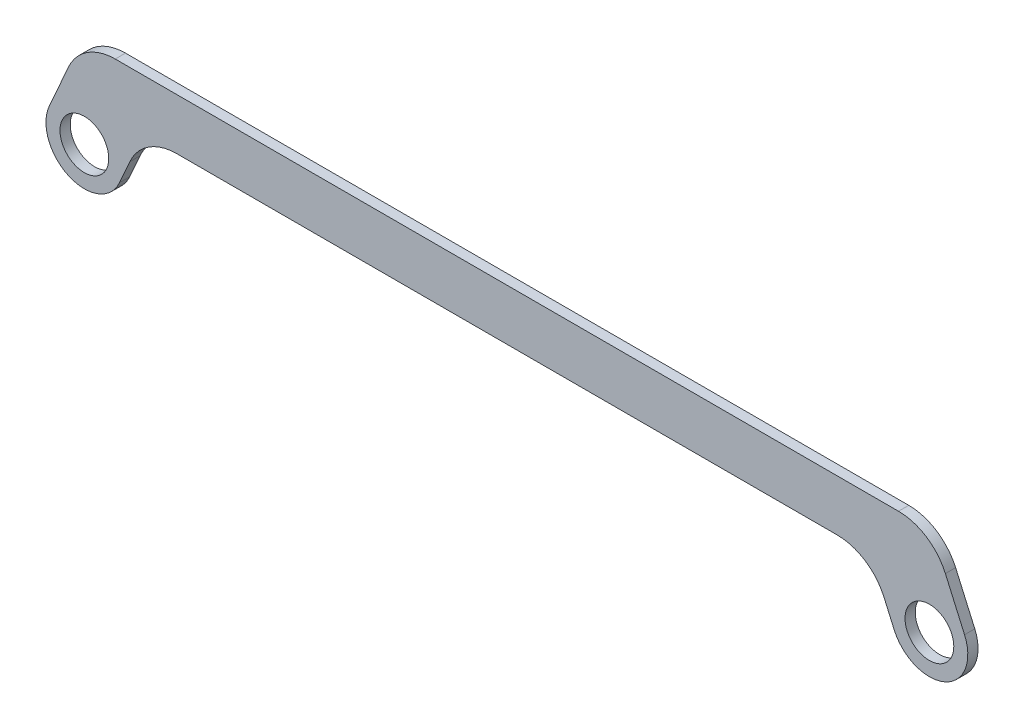
ISO-10303-21;
HEADER;
FILE_DESCRIPTION(('STEP AP214'),'2;1');
FILE_NAME('part.step','',(''),(''),'','','');
FILE_SCHEMA(('AUTOMOTIVE_DESIGN { 1 0 10303 214 1 1 1 1 }'));
ENDSEC;
DATA;
#1=APPLICATION_CONTEXT('core data for automotive mechanical design processes');
#2=APPLICATION_PROTOCOL_DEFINITION('international standard','automotive_design',2000,#1);
#3=PRODUCT_CONTEXT('',#1,'mechanical');
#4=PRODUCT('Part','Part','',(#3));
#5=PRODUCT_RELATED_PRODUCT_CATEGORY('part','',(#4));
#6=PRODUCT_DEFINITION_FORMATION('','',#4);
#7=PRODUCT_DEFINITION_CONTEXT('part definition',#1,'design');
#8=PRODUCT_DEFINITION('design','',#6,#7);
#9=PRODUCT_DEFINITION_SHAPE('','',#8);
#10=(LENGTH_UNIT() NAMED_UNIT(*) SI_UNIT(.MILLI.,.METRE.));
#11=(NAMED_UNIT(*) PLANE_ANGLE_UNIT() SI_UNIT($,.RADIAN.));
#12=(NAMED_UNIT(*) SI_UNIT($,.STERADIAN.) SOLID_ANGLE_UNIT());
#13=UNCERTAINTY_MEASURE_WITH_UNIT(LENGTH_MEASURE(1.E-05),#10,'distance_accuracy_value','');
#14=(GEOMETRIC_REPRESENTATION_CONTEXT(3) GLOBAL_UNCERTAINTY_ASSIGNED_CONTEXT((#13)) GLOBAL_UNIT_ASSIGNED_CONTEXT((#10,
#11,#12)) REPRESENTATION_CONTEXT('',''));
#15=CARTESIAN_POINT('',(0.,0.,0.));
#16=DIRECTION('',(0.,0.,1.));
#17=DIRECTION('',(1.,0.,0.));
#18=AXIS2_PLACEMENT_3D('',#15,#16,#17);
#19=CARTESIAN_POINT('',(0.,0.,4.));
#20=DIRECTION('',(0.,0.,-1.));
#21=DIRECTION('',(-1.,0.,0.));
#22=AXIS2_PLACEMENT_3D('',#19,#20,#21);
#23=PLANE('',#22);
#24=DIRECTION('',(-0.403699080087146,0.914891825702248,0.));
#25=VECTOR('',#24,1.);
#26=CARTESIAN_POINT('',(343.723377385534,6.05548620130718,4.));
#27=LINE('',#26,#25);
#28=CARTESIAN_POINT('',(343.723377385534,6.05548620130718,4.));
#29=VERTEX_POINT('',#28);
#30=CARTESIAN_POINT('',(336.242456449768,23.0092860746674,4.));
#31=VERTEX_POINT('',#30);
#32=EDGE_CURVE('E207',#29,#31,#27,.T.);
#33=ORIENTED_EDGE('',*,*,#32,.T.);
#34=CARTESIAN_POINT('',(317.944619935723,14.9353044729245,4.));
#35=DIRECTION('',(0.,0.,-1.));
#36=DIRECTION('',(-1.,0.,0.));
#37=AXIS2_PLACEMENT_3D('',#34,#35,#36);
#38=CIRCLE('',#37,20.);
#39=CARTESIAN_POINT('',(317.944619935723,34.9353044729245,4.));
#40=VERTEX_POINT('',#39);
#41=EDGE_CURVE('E174',#31,#40,#38,.F.);
#42=ORIENTED_EDGE('',*,*,#41,.T.);
#43=DIRECTION('',(-1.,0.,0.));
#44=VECTOR('',#43,1.);
#45=CARTESIAN_POINT('',(-0.980060917068303,34.9353044729245,4.));
#46=LINE('',#45,#44);
#47=CARTESIAN_POINT('',(12.0553800642772,34.9353044729245,4.));
#48=VERTEX_POINT('',#47);
#49=EDGE_CURVE('E209',#40,#48,#46,.T.);
#50=ORIENTED_EDGE('',*,*,#49,.T.);
#51=CARTESIAN_POINT('',(12.0553800642772,14.9353044729245,4.));
#52=DIRECTION('',(0.,0.,-1.));
#53=DIRECTION('',(-1.,0.,0.));
#54=AXIS2_PLACEMENT_3D('',#51,#52,#53);
#55=CIRCLE('',#54,20.);
#56=CARTESIAN_POINT('',(-6.24245644976776,23.0092860746674,4.));
#57=VERTEX_POINT('',#56);
#58=EDGE_CURVE('E52',#48,#57,#55,.F.);
#59=ORIENTED_EDGE('',*,*,#58,.T.);
#60=DIRECTION('',(-0.403699080087146,-0.914891825702248,0.));
#61=VECTOR('',#60,1.);
#62=CARTESIAN_POINT('',(-13.7233773855337,6.05548620130718,4.));
#63=LINE('',#62,#61);
#64=CARTESIAN_POINT('',(-13.7233773855337,6.05548620130718,4.));
#65=VERTEX_POINT('',#64);
#66=EDGE_CURVE('E138',#57,#65,#63,.T.);
#67=ORIENTED_EDGE('',*,*,#66,.T.);
#68=CARTESIAN_POINT('',(0.,0.,4.));
#69=DIRECTION('',(0.,0.,1.));
#70=DIRECTION('',(-1.,0.,0.));
#71=AXIS2_PLACEMENT_3D('',#68,#69,#70);
#72=CIRCLE('',#71,15.);
#73=CARTESIAN_POINT('',(13.7233773855337,-6.05548620130718,4.));
#74=VERTEX_POINT('',#73);
#75=EDGE_CURVE('E133',#65,#74,#72,.T.);
#76=ORIENTED_EDGE('',*,*,#75,.T.);
#77=DIRECTION('',(0.403699080087146,0.914891825702248,0.));
#78=VECTOR('',#77,1.);
#79=CARTESIAN_POINT('',(13.7233773855337,-6.05548620130718,4.));
#80=LINE('',#79,#78);
#81=CARTESIAN_POINT('',(17.7232384906447,3.0092860746674,4.));
#82=VERTEX_POINT('',#81);
#83=EDGE_CURVE('E125',#74,#82,#80,.T.);
#84=ORIENTED_EDGE('',*,*,#83,.T.);
#85=CARTESIAN_POINT('',(36.0210750046897,-5.06469552707551,4.));
#86=DIRECTION('',(0.,0.,-1.));
#87=DIRECTION('',(-1.,0.,0.));
#88=AXIS2_PLACEMENT_3D('',#85,#86,#87);
#89=CIRCLE('',#88,20.);
#90=CARTESIAN_POINT('',(36.0210750046897,14.9353044729245,4.));
#91=VERTEX_POINT('',#90);
#92=EDGE_CURVE('E11',#82,#91,#89,.T.);
#93=ORIENTED_EDGE('',*,*,#92,.T.);
#94=DIRECTION('',(1.,0.,0.));
#95=VECTOR('',#94,1.);
#96=CARTESIAN_POINT('',(22.9856340233442,14.9353044729245,4.));
#97=LINE('',#96,#95);
#98=CARTESIAN_POINT('',(293.97892499531,14.9353044729245,4.));
#99=VERTEX_POINT('',#98);
#100=EDGE_CURVE('E132',#91,#99,#97,.T.);
#101=ORIENTED_EDGE('',*,*,#100,.T.);
#102=CARTESIAN_POINT('',(293.97892499531,-5.06469552707551,4.));
#103=DIRECTION('',(0.,0.,-1.));
#104=DIRECTION('',(-1.,0.,0.));
#105=AXIS2_PLACEMENT_3D('',#102,#103,#104);
#106=CIRCLE('',#105,20.);
#107=CARTESIAN_POINT('',(312.276761509355,3.00928607466739,4.));
#108=VERTEX_POINT('',#107);
#109=EDGE_CURVE('E182',#99,#108,#106,.T.);
#110=ORIENTED_EDGE('',*,*,#109,.T.);
#111=DIRECTION('',(0.403699080087146,-0.914891825702248,0.));
#112=VECTOR('',#111,1.);
#113=CARTESIAN_POINT('',(316.276622614466,-6.05548620130718,4.));
#114=LINE('',#113,#112);
#115=CARTESIAN_POINT('',(316.276622614466,-6.05548620130718,4.));
#116=VERTEX_POINT('',#115);
#117=EDGE_CURVE('E201',#108,#116,#114,.T.);
#118=ORIENTED_EDGE('',*,*,#117,.T.);
#119=CARTESIAN_POINT('',(330.,0.,4.));
#120=DIRECTION('',(0.,0.,1.));
#121=DIRECTION('',(1.,0.,0.));
#122=AXIS2_PLACEMENT_3D('',#119,#120,#121);
#123=CIRCLE('',#122,15.);
#124=EDGE_CURVE('E203',#116,#29,#123,.T.);
#125=ORIENTED_EDGE('',*,*,#124,.T.);
#126=EDGE_LOOP('',(#33,#42,#50,#59,#67,#76,#84,#93,#101,#110,#118,#125));
#127=FACE_BOUND('',#126,.T.);
#128=CARTESIAN_POINT('',(0.,0.,4.));
#129=DIRECTION('',(0.,0.,1.));
#130=DIRECTION('',(1.,0.,0.));
#131=AXIS2_PLACEMENT_3D('',#128,#129,#130);
#132=CIRCLE('',#131,9.525);
#133=CARTESIAN_POINT('',(9.525,0.,4.));
#134=VERTEX_POINT('',#133);
#135=EDGE_CURVE('E213',#134,#134,#132,.T.);
#136=ORIENTED_EDGE('',*,*,#135,.F.);
#137=EDGE_LOOP('',(#136));
#138=FACE_BOUND('',#137,.T.);
#139=CARTESIAN_POINT('',(330.,0.,4.));
#140=DIRECTION('',(0.,0.,1.));
#141=DIRECTION('',(1.,0.,0.));
#142=AXIS2_PLACEMENT_3D('',#139,#140,#141);
#143=CIRCLE('',#142,9.52500000000002);
#144=CARTESIAN_POINT('',(339.525,0.,4.));
#145=VERTEX_POINT('',#144);
#146=EDGE_CURVE('E282',#145,#145,#143,.T.);
#147=ORIENTED_EDGE('',*,*,#146,.F.);
#148=EDGE_LOOP('',(#147));
#149=FACE_BOUND('',#148,.T.);
#150=ADVANCED_FACE('F37',(#127,#138,#149),#23,.F.);
#151=CARTESIAN_POINT('',(0.,0.,0.));
#152=DIRECTION('',(0.,0.,-1.));
#153=DIRECTION('',(-1.,0.,0.));
#154=AXIS2_PLACEMENT_3D('',#151,#152,#153);
#155=PLANE('',#154);
#156=CARTESIAN_POINT('',(0.,0.,0.));
#157=DIRECTION('',(0.,0.,1.));
#158=DIRECTION('',(1.,0.,0.));
#159=AXIS2_PLACEMENT_3D('',#156,#157,#158);
#160=CIRCLE('',#159,9.525);
#161=CARTESIAN_POINT('',(9.525,0.,0.));
#162=VERTEX_POINT('',#161);
#163=EDGE_CURVE('E287',#162,#162,#160,.T.);
#164=ORIENTED_EDGE('',*,*,#163,.T.);
#165=EDGE_LOOP('',(#164));
#166=FACE_BOUND('',#165,.T.);
#167=DIRECTION('',(-1.,0.,0.));
#168=VECTOR('',#167,1.);
#169=CARTESIAN_POINT('',(-0.980060917068303,34.9353044729245,0.));
#170=LINE('',#169,#168);
#171=CARTESIAN_POINT('',(317.944619935723,34.9353044729245,0.));
#172=VERTEX_POINT('',#171);
#173=CARTESIAN_POINT('',(12.0553800642772,34.9353044729245,0.));
#174=VERTEX_POINT('',#173);
#175=EDGE_CURVE('E223',#172,#174,#170,.T.);
#176=ORIENTED_EDGE('',*,*,#175,.F.);
#177=CARTESIAN_POINT('',(317.944619935723,14.9353044729245,0.));
#178=DIRECTION('',(0.,0.,-1.));
#179=DIRECTION('',(-1.,0.,0.));
#180=AXIS2_PLACEMENT_3D('',#177,#178,#179);
#181=CIRCLE('',#180,20.);
#182=CARTESIAN_POINT('',(336.242456449768,23.0092860746674,0.));
#183=VERTEX_POINT('',#182);
#184=EDGE_CURVE('E169',#172,#183,#181,.T.);
#185=ORIENTED_EDGE('',*,*,#184,.T.);
#186=DIRECTION('',(-0.403699080087146,0.914891825702248,0.));
#187=VECTOR('',#186,1.);
#188=CARTESIAN_POINT('',(343.723377385534,6.05548620130718,0.));
#189=LINE('',#188,#187);
#190=CARTESIAN_POINT('',(343.723377385534,6.05548620130718,0.));
#191=VERTEX_POINT('',#190);
#192=EDGE_CURVE('E220',#191,#183,#189,.T.);
#193=ORIENTED_EDGE('',*,*,#192,.F.);
#194=CARTESIAN_POINT('',(330.,0.,0.));
#195=DIRECTION('',(0.,0.,1.));
#196=DIRECTION('',(1.,0.,0.));
#197=AXIS2_PLACEMENT_3D('',#194,#195,#196);
#198=CIRCLE('',#197,15.);
#199=CARTESIAN_POINT('',(316.276622614466,-6.05548620130718,0.));
#200=VERTEX_POINT('',#199);
#201=EDGE_CURVE('E218',#200,#191,#198,.T.);
#202=ORIENTED_EDGE('',*,*,#201,.F.);
#203=DIRECTION('',(0.403699080087146,-0.914891825702248,0.));
#204=VECTOR('',#203,1.);
#205=CARTESIAN_POINT('',(316.276622614466,-6.05548620130718,0.));
#206=LINE('',#205,#204);
#207=CARTESIAN_POINT('',(312.276761509355,3.00928607466739,0.));
#208=VERTEX_POINT('',#207);
#209=EDGE_CURVE('E216',#208,#200,#206,.T.);
#210=ORIENTED_EDGE('',*,*,#209,.F.);
#211=CARTESIAN_POINT('',(293.97892499531,-5.06469552707551,0.));
#212=DIRECTION('',(0.,0.,-1.));
#213=DIRECTION('',(-1.,0.,0.));
#214=AXIS2_PLACEMENT_3D('',#211,#212,#213);
#215=CIRCLE('',#214,20.);
#216=CARTESIAN_POINT('',(293.97892499531,14.9353044729245,0.));
#217=VERTEX_POINT('',#216);
#218=EDGE_CURVE('E180',#208,#217,#215,.F.);
#219=ORIENTED_EDGE('',*,*,#218,.T.);
#220=DIRECTION('',(1.,0.,0.));
#221=VECTOR('',#220,1.);
#222=CARTESIAN_POINT('',(22.9856340233442,14.9353044729245,0.));
#223=LINE('',#222,#221);
#224=CARTESIAN_POINT('',(36.0210750046897,14.9353044729245,0.));
#225=VERTEX_POINT('',#224);
#226=EDGE_CURVE('E190',#225,#217,#223,.T.);
#227=ORIENTED_EDGE('',*,*,#226,.F.);
#228=CARTESIAN_POINT('',(36.0210750046897,-5.06469552707551,0.));
#229=DIRECTION('',(0.,0.,-1.));
#230=DIRECTION('',(-1.,0.,0.));
#231=AXIS2_PLACEMENT_3D('',#228,#229,#230);
#232=CIRCLE('',#231,20.);
#233=CARTESIAN_POINT('',(17.7232384906447,3.0092860746674,0.));
#234=VERTEX_POINT('',#233);
#235=EDGE_CURVE('E45',#225,#234,#232,.F.);
#236=ORIENTED_EDGE('',*,*,#235,.T.);
#237=DIRECTION('',(0.403699080087146,0.914891825702248,0.));
#238=VECTOR('',#237,1.);
#239=CARTESIAN_POINT('',(13.7233773855337,-6.05548620130718,0.));
#240=LINE('',#239,#238);
#241=CARTESIAN_POINT('',(13.7233773855337,-6.05548620130718,0.));
#242=VERTEX_POINT('',#241);
#243=EDGE_CURVE('E188',#242,#234,#240,.T.);
#244=ORIENTED_EDGE('',*,*,#243,.F.);
#245=CARTESIAN_POINT('',(0.,0.,0.));
#246=DIRECTION('',(0.,0.,1.));
#247=DIRECTION('',(-1.,0.,0.));
#248=AXIS2_PLACEMENT_3D('',#245,#246,#247);
#249=CIRCLE('',#248,15.);
#250=CARTESIAN_POINT('',(-13.7233773855337,6.05548620130718,0.));
#251=VERTEX_POINT('',#250);
#252=EDGE_CURVE('E146',#251,#242,#249,.T.);
#253=ORIENTED_EDGE('',*,*,#252,.F.);
#254=DIRECTION('',(-0.403699080087146,-0.914891825702248,0.));
#255=VECTOR('',#254,1.);
#256=CARTESIAN_POINT('',(-13.7233773855337,6.05548620130718,0.));
#257=LINE('',#256,#255);
#258=CARTESIAN_POINT('',(-6.24245644976776,23.0092860746674,0.));
#259=VERTEX_POINT('',#258);
#260=EDGE_CURVE('E142',#259,#251,#257,.T.);
#261=ORIENTED_EDGE('',*,*,#260,.F.);
#262=CARTESIAN_POINT('',(12.0553800642772,14.9353044729245,0.));
#263=DIRECTION('',(0.,0.,-1.));
#264=DIRECTION('',(-1.,0.,0.));
#265=AXIS2_PLACEMENT_3D('',#262,#263,#264);
#266=CIRCLE('',#265,20.);
#267=EDGE_CURVE('E167',#259,#174,#266,.T.);
#268=ORIENTED_EDGE('',*,*,#267,.T.);
#269=EDGE_LOOP('',(#176,#185,#193,#202,#210,#219,#227,#236,#244,#253,#261,#268));
#270=FACE_BOUND('',#269,.T.);
#271=CARTESIAN_POINT('',(330.,0.,0.));
#272=DIRECTION('',(0.,0.,1.));
#273=DIRECTION('',(1.,0.,0.));
#274=AXIS2_PLACEMENT_3D('',#271,#272,#273);
#275=CIRCLE('',#274,9.52500000000002);
#276=CARTESIAN_POINT('',(339.525,0.,0.));
#277=VERTEX_POINT('',#276);
#278=EDGE_CURVE('E285',#277,#277,#275,.T.);
#279=ORIENTED_EDGE('',*,*,#278,.T.);
#280=EDGE_LOOP('',(#279));
#281=FACE_BOUND('',#280,.T.);
#282=ADVANCED_FACE('F186',(#166,#270,#281),#155,.T.);
#283=CARTESIAN_POINT('',(0.,0.,4.));
#284=DIRECTION('',(0.,0.,-1.));
#285=DIRECTION('',(-1.,0.,0.));
#286=AXIS2_PLACEMENT_3D('',#283,#284,#285);
#287=CYLINDRICAL_SURFACE('',#286,15.);
#288=ORIENTED_EDGE('',*,*,#252,.T.);
#289=DIRECTION('',(0.,0.,-1.));
#290=VECTOR('',#289,1.);
#291=CARTESIAN_POINT('',(13.7233773855337,-6.05548620130718,4.));
#292=LINE('',#291,#290);
#293=EDGE_CURVE('E129',#74,#242,#292,.T.);
#294=ORIENTED_EDGE('',*,*,#293,.F.);
#295=ORIENTED_EDGE('',*,*,#75,.F.);
#296=DIRECTION('',(0.,0.,-1.));
#297=VECTOR('',#296,1.);
#298=CARTESIAN_POINT('',(-13.7233773855337,6.05548620130718,4.));
#299=LINE('',#298,#297);
#300=EDGE_CURVE('E212',#65,#251,#299,.T.);
#301=ORIENTED_EDGE('',*,*,#300,.T.);
#302=EDGE_LOOP('',(#288,#294,#295,#301));
#303=FACE_BOUND('',#302,.T.);
#304=ADVANCED_FACE('F144',(#303),#287,.T.);
#305=CARTESIAN_POINT('',(13.7233773855337,-6.05548620130718,4.));
#306=DIRECTION('',(-0.914891825702248,0.403699080087146,0.));
#307=DIRECTION('',(-0.403699080087146,-0.914891825702248,0.));
#308=AXIS2_PLACEMENT_3D('',#305,#306,#307);
#309=PLANE('',#308);
#310=ORIENTED_EDGE('',*,*,#243,.T.);
#311=DIRECTION('',(0.,0.,-1.));
#312=VECTOR('',#311,1.);
#313=CARTESIAN_POINT('',(17.7232384906447,3.0092860746674,4.));
#314=LINE('',#313,#312);
#315=EDGE_CURVE('E60',#234,#82,#314,.F.);
#316=ORIENTED_EDGE('',*,*,#315,.T.);
#317=ORIENTED_EDGE('',*,*,#83,.F.);
#318=ORIENTED_EDGE('',*,*,#293,.T.);
#319=EDGE_LOOP('',(#310,#316,#317,#318));
#320=FACE_BOUND('',#319,.T.);
#321=ADVANCED_FACE('F127',(#320),#309,.F.);
#322=CARTESIAN_POINT('',(22.9856340233442,14.9353044729245,4.));
#323=DIRECTION('',(0.,1.,0.));
#324=DIRECTION('',(0.,0.,1.));
#325=AXIS2_PLACEMENT_3D('',#322,#323,#324);
#326=PLANE('',#325);
#327=ORIENTED_EDGE('',*,*,#226,.T.);
#328=DIRECTION('',(0.,0.,-1.));
#329=VECTOR('',#328,1.);
#330=CARTESIAN_POINT('',(293.97892499531,14.9353044729245,4.));
#331=LINE('',#330,#329);
#332=EDGE_CURVE('E160',#217,#99,#331,.F.);
#333=ORIENTED_EDGE('',*,*,#332,.T.);
#334=ORIENTED_EDGE('',*,*,#100,.F.);
#335=DIRECTION('',(0.,0.,-1.));
#336=VECTOR('',#335,1.);
#337=CARTESIAN_POINT('',(36.0210750046897,14.9353044729245,0.));
#338=LINE('',#337,#336);
#339=EDGE_CURVE('E151',#91,#225,#338,.T.);
#340=ORIENTED_EDGE('',*,*,#339,.T.);
#341=EDGE_LOOP('',(#327,#333,#334,#340));
#342=FACE_BOUND('',#341,.T.);
#343=ADVANCED_FACE('F199',(#342),#326,.F.);
#344=CARTESIAN_POINT('',(316.276622614466,-6.05548620130718,4.));
#345=DIRECTION('',(0.914891825702248,0.403699080087146,0.));
#346=DIRECTION('',(-0.403699080087146,0.914891825702248,0.));
#347=AXIS2_PLACEMENT_3D('',#344,#345,#346);
#348=PLANE('',#347);
#349=ORIENTED_EDGE('',*,*,#117,.F.);
#350=DIRECTION('',(0.,0.,-1.));
#351=VECTOR('',#350,1.);
#352=CARTESIAN_POINT('',(312.276761509355,3.0092860746674,0.));
#353=LINE('',#352,#351);
#354=EDGE_CURVE('E147',#108,#208,#353,.T.);
#355=ORIENTED_EDGE('',*,*,#354,.T.);
#356=ORIENTED_EDGE('',*,*,#209,.T.);
#357=DIRECTION('',(0.,0.,-1.));
#358=VECTOR('',#357,1.);
#359=CARTESIAN_POINT('',(316.276622614466,-6.05548620130718,4.));
#360=LINE('',#359,#358);
#361=EDGE_CURVE('E148',#116,#200,#360,.T.);
#362=ORIENTED_EDGE('',*,*,#361,.F.);
#363=EDGE_LOOP('',(#349,#355,#356,#362));
#364=FACE_BOUND('',#363,.T.);
#365=ADVANCED_FACE('F358',(#364),#348,.F.);
#366=CARTESIAN_POINT('',(330.,0.,4.));
#367=DIRECTION('',(0.,0.,-1.));
#368=DIRECTION('',(-1.,0.,0.));
#369=AXIS2_PLACEMENT_3D('',#366,#367,#368);
#370=CYLINDRICAL_SURFACE('',#369,15.);
#371=ORIENTED_EDGE('',*,*,#201,.T.);
#372=DIRECTION('',(0.,0.,-1.));
#373=VECTOR('',#372,1.);
#374=CARTESIAN_POINT('',(343.723377385534,6.05548620130718,4.));
#375=LINE('',#374,#373);
#376=EDGE_CURVE('E154',#29,#191,#375,.T.);
#377=ORIENTED_EDGE('',*,*,#376,.F.);
#378=ORIENTED_EDGE('',*,*,#124,.F.);
#379=ORIENTED_EDGE('',*,*,#361,.T.);
#380=EDGE_LOOP('',(#371,#377,#378,#379));
#381=FACE_BOUND('',#380,.T.);
#382=ADVANCED_FACE('F351',(#381),#370,.T.);
#383=CARTESIAN_POINT('',(343.723377385534,6.05548620130718,4.));
#384=DIRECTION('',(-0.914891825702248,-0.403699080087146,0.));
#385=DIRECTION('',(0.403699080087146,-0.914891825702248,0.));
#386=AXIS2_PLACEMENT_3D('',#383,#384,#385);
#387=PLANE('',#386);
#388=ORIENTED_EDGE('',*,*,#192,.T.);
#389=DIRECTION('',(0.,0.,-1.));
#390=VECTOR('',#389,1.);
#391=CARTESIAN_POINT('',(336.242456449768,23.0092860746674,4.));
#392=LINE('',#391,#390);
#393=EDGE_CURVE('E171',#183,#31,#392,.F.);
#394=ORIENTED_EDGE('',*,*,#393,.T.);
#395=ORIENTED_EDGE('',*,*,#32,.F.);
#396=ORIENTED_EDGE('',*,*,#376,.T.);
#397=EDGE_LOOP('',(#388,#394,#395,#396));
#398=FACE_BOUND('',#397,.T.);
#399=ADVANCED_FACE('F232',(#398),#387,.F.);
#400=CARTESIAN_POINT('',(-0.980060917068303,34.9353044729245,4.));
#401=DIRECTION('',(0.,-1.,0.));
#402=DIRECTION('',(0.,0.,-1.));
#403=AXIS2_PLACEMENT_3D('',#400,#401,#402);
#404=PLANE('',#403);
#405=ORIENTED_EDGE('',*,*,#49,.F.);
#406=DIRECTION('',(0.,0.,-1.));
#407=VECTOR('',#406,1.);
#408=CARTESIAN_POINT('',(317.944619935723,34.9353044729245,4.));
#409=LINE('',#408,#407);
#410=EDGE_CURVE('E164',#40,#172,#409,.T.);
#411=ORIENTED_EDGE('',*,*,#410,.T.);
#412=ORIENTED_EDGE('',*,*,#175,.T.);
#413=DIRECTION('',(0.,0.,-1.));
#414=VECTOR('',#413,1.);
#415=CARTESIAN_POINT('',(12.0553800642772,34.9353044729245,4.));
#416=LINE('',#415,#414);
#417=EDGE_CURVE('E162',#174,#48,#416,.F.);
#418=ORIENTED_EDGE('',*,*,#417,.T.);
#419=EDGE_LOOP('',(#405,#411,#412,#418));
#420=FACE_BOUND('',#419,.T.);
#421=ADVANCED_FACE('F244',(#420),#404,.F.);
#422=CARTESIAN_POINT('',(-13.7233773855337,6.05548620130718,4.));
#423=DIRECTION('',(0.914891825702248,-0.403699080087146,0.));
#424=DIRECTION('',(0.403699080087146,0.914891825702248,0.));
#425=AXIS2_PLACEMENT_3D('',#422,#423,#424);
#426=PLANE('',#425);
#427=ORIENTED_EDGE('',*,*,#66,.F.);
#428=DIRECTION('',(0.,0.,-1.));
#429=VECTOR('',#428,1.);
#430=CARTESIAN_POINT('',(-6.24245644976776,23.0092860746674,4.));
#431=LINE('',#430,#429);
#432=EDGE_CURVE('E177',#57,#259,#431,.T.);
#433=ORIENTED_EDGE('',*,*,#432,.T.);
#434=ORIENTED_EDGE('',*,*,#260,.T.);
#435=ORIENTED_EDGE('',*,*,#300,.F.);
#436=EDGE_LOOP('',(#427,#433,#434,#435));
#437=FACE_BOUND('',#436,.T.);
#438=ADVANCED_FACE('F250',(#437),#426,.F.);
#439=CARTESIAN_POINT('',(0.,0.,4.));
#440=DIRECTION('',(0.,0.,-1.));
#441=DIRECTION('',(-1.,0.,0.));
#442=AXIS2_PLACEMENT_3D('',#439,#440,#441);
#443=CYLINDRICAL_SURFACE('',#442,9.525);
#444=ORIENTED_EDGE('',*,*,#135,.T.);
#445=EDGE_LOOP('',(#444));
#446=FACE_BOUND('',#445,.T.);
#447=ORIENTED_EDGE('',*,*,#163,.F.);
#448=EDGE_LOOP('',(#447));
#449=FACE_BOUND('',#448,.T.);
#450=ADVANCED_FACE('F252',(#446,#449),#443,.F.);
#451=CARTESIAN_POINT('',(330.,0.,4.));
#452=DIRECTION('',(0.,0.,-1.));
#453=DIRECTION('',(-1.,0.,0.));
#454=AXIS2_PLACEMENT_3D('',#451,#452,#453);
#455=CYLINDRICAL_SURFACE('',#454,9.52500000000002);
#456=ORIENTED_EDGE('',*,*,#146,.T.);
#457=EDGE_LOOP('',(#456));
#458=FACE_BOUND('',#457,.T.);
#459=ORIENTED_EDGE('',*,*,#278,.F.);
#460=EDGE_LOOP('',(#459));
#461=FACE_BOUND('',#460,.T.);
#462=ADVANCED_FACE('F259',(#458,#461),#455,.F.);
#463=CARTESIAN_POINT('',(293.97892499531,-5.06469552707551,4.));
#464=DIRECTION('',(0.,0.,1.));
#465=DIRECTION('',(1.,0.,0.));
#466=AXIS2_PLACEMENT_3D('',#463,#464,#465);
#467=CYLINDRICAL_SURFACE('',#466,20.);
#468=ORIENTED_EDGE('',*,*,#109,.F.);
#469=ORIENTED_EDGE('',*,*,#332,.F.);
#470=ORIENTED_EDGE('',*,*,#218,.F.);
#471=ORIENTED_EDGE('',*,*,#354,.F.);
#472=EDGE_LOOP('',(#468,#469,#470,#471));
#473=FACE_BOUND('',#472,.T.);
#474=ADVANCED_FACE('F273',(#473),#467,.F.);
#475=CARTESIAN_POINT('',(317.944619935723,14.9353044729245,4.));
#476=DIRECTION('',(0.,0.,-1.));
#477=DIRECTION('',(-1.,0.,0.));
#478=AXIS2_PLACEMENT_3D('',#475,#476,#477);
#479=CYLINDRICAL_SURFACE('',#478,20.);
#480=ORIENTED_EDGE('',*,*,#41,.F.);
#481=ORIENTED_EDGE('',*,*,#393,.F.);
#482=ORIENTED_EDGE('',*,*,#184,.F.);
#483=ORIENTED_EDGE('',*,*,#410,.F.);
#484=EDGE_LOOP('',(#480,#481,#482,#483));
#485=FACE_BOUND('',#484,.T.);
#486=ADVANCED_FACE('F241',(#485),#479,.T.);
#487=CARTESIAN_POINT('',(36.0210750046897,-5.06469552707551,4.));
#488=DIRECTION('',(0.,0.,1.));
#489=DIRECTION('',(1.,0.,0.));
#490=AXIS2_PLACEMENT_3D('',#487,#488,#489);
#491=CYLINDRICAL_SURFACE('',#490,20.);
#492=ORIENTED_EDGE('',*,*,#92,.F.);
#493=ORIENTED_EDGE('',*,*,#315,.F.);
#494=ORIENTED_EDGE('',*,*,#235,.F.);
#495=ORIENTED_EDGE('',*,*,#339,.F.);
#496=EDGE_LOOP('',(#492,#493,#494,#495));
#497=FACE_BOUND('',#496,.T.);
#498=ADVANCED_FACE('F194',(#497),#491,.F.);
#499=CARTESIAN_POINT('',(12.0553800642772,14.9353044729245,4.));
#500=DIRECTION('',(0.,0.,-1.));
#501=DIRECTION('',(-1.,0.,0.));
#502=AXIS2_PLACEMENT_3D('',#499,#500,#501);
#503=CYLINDRICAL_SURFACE('',#502,20.);
#504=ORIENTED_EDGE('',*,*,#58,.F.);
#505=ORIENTED_EDGE('',*,*,#417,.F.);
#506=ORIENTED_EDGE('',*,*,#267,.F.);
#507=ORIENTED_EDGE('',*,*,#432,.F.);
#508=EDGE_LOOP('',(#504,#505,#506,#507));
#509=FACE_BOUND('',#508,.T.);
#510=ADVANCED_FACE('F39',(#509),#503,.T.);
#511=CLOSED_SHELL('',(#150,#282,#304,#321,#343,#365,#382,#399,#421,#438,#450,#462,#474,#486,
#498,#510));
#512=MANIFOLD_SOLID_BREP('B2',#511);
#513=ADVANCED_BREP_SHAPE_REPRESENTATION('',(#18,#512),#14);
#514=SHAPE_DEFINITION_REPRESENTATION(#9,#513);
ENDSEC;
END-ISO-10303-21;
